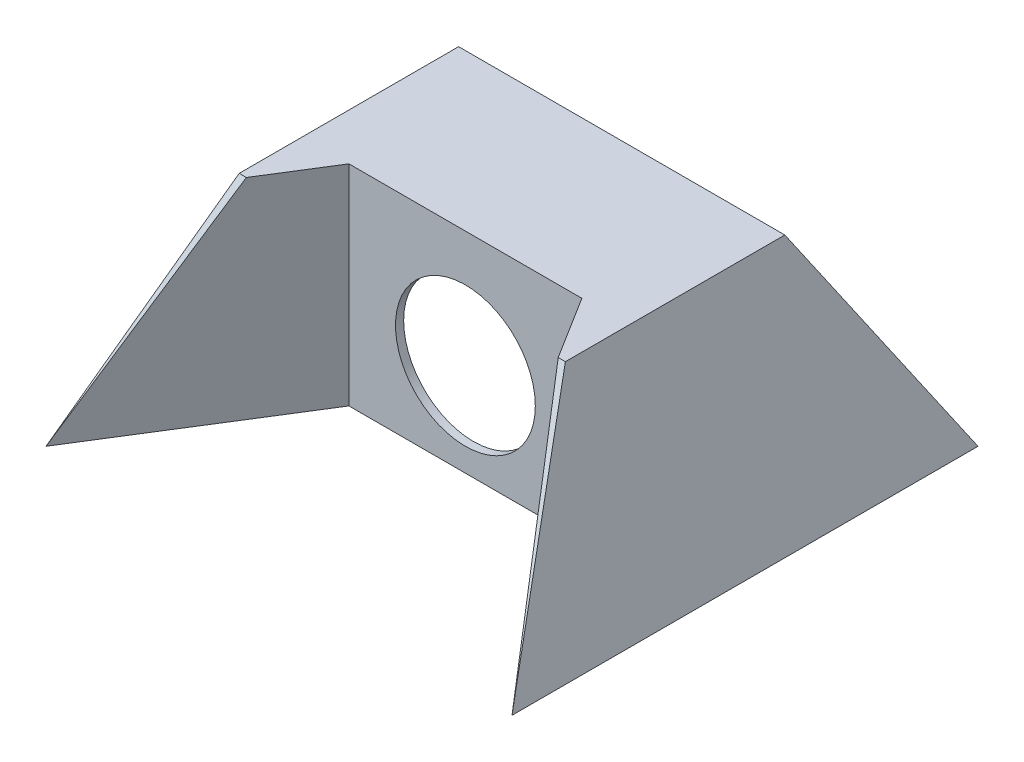
ISO-10303-21;
HEADER;
FILE_DESCRIPTION(('STEP AP214'),'2;1');
FILE_NAME('part.step','',(''),(''),'','','');
FILE_SCHEMA(('AUTOMOTIVE_DESIGN { 1 0 10303 214 1 1 1 1 }'));
ENDSEC;
DATA;
#1=APPLICATION_CONTEXT('core data for automotive mechanical design processes');
#2=APPLICATION_PROTOCOL_DEFINITION('international standard','automotive_design',2000,#1);
#3=PRODUCT_CONTEXT('',#1,'mechanical');
#4=PRODUCT('Part','Part','',(#3));
#5=PRODUCT_RELATED_PRODUCT_CATEGORY('part','',(#4));
#6=PRODUCT_DEFINITION_FORMATION('','',#4);
#7=PRODUCT_DEFINITION_CONTEXT('part definition',#1,'design');
#8=PRODUCT_DEFINITION('design','',#6,#7);
#9=PRODUCT_DEFINITION_SHAPE('','',#8);
#10=(LENGTH_UNIT() NAMED_UNIT(*) SI_UNIT(.MILLI.,.METRE.));
#11=(NAMED_UNIT(*) PLANE_ANGLE_UNIT() SI_UNIT($,.RADIAN.));
#12=(NAMED_UNIT(*) SI_UNIT($,.STERADIAN.) SOLID_ANGLE_UNIT());
#13=UNCERTAINTY_MEASURE_WITH_UNIT(LENGTH_MEASURE(1.E-05),#10,'distance_accuracy_value','');
#14=(GEOMETRIC_REPRESENTATION_CONTEXT(3) GLOBAL_UNCERTAINTY_ASSIGNED_CONTEXT((#13)) GLOBAL_UNIT_ASSIGNED_CONTEXT((#10,
#11,#12)) REPRESENTATION_CONTEXT('',''));
#15=CARTESIAN_POINT('',(0.,0.,0.));
#16=DIRECTION('',(0.,0.,1.));
#17=DIRECTION('',(1.,0.,0.));
#18=AXIS2_PLACEMENT_3D('',#15,#16,#17);
#19=CARTESIAN_POINT('',(0.,0.,-100.));
#20=DIRECTION('',(0.,-1.,0.));
#21=DIRECTION('',(0.,0.,-1.));
#22=AXIS2_PLACEMENT_3D('',#19,#20,#21);
#23=PLANE('',#22);
#24=DIRECTION('',(0.52999894000318,0.,0.847998304005088));
#25=VECTOR('',#24,1.);
#26=CARTESIAN_POINT('',(100.,0.,0.));
#27=LINE('',#26,#25);
#28=CARTESIAN_POINT('',(75.,0.,-40.));
#29=VERTEX_POINT('',#28);
#30=CARTESIAN_POINT('',(100.,0.,0.));
#31=VERTEX_POINT('',#30);
#32=EDGE_CURVE('E198',#29,#31,#27,.T.);
#33=ORIENTED_EDGE('',*,*,#32,.F.);
#34=DIRECTION('',(1.,0.,0.));
#35=VECTOR('',#34,1.);
#36=CARTESIAN_POINT('',(75.,0.,-40.));
#37=LINE('',#36,#35);
#38=CARTESIAN_POINT('',(25.,0.,-40.));
#39=VERTEX_POINT('',#38);
#40=EDGE_CURVE('E207',#39,#29,#37,.T.);
#41=ORIENTED_EDGE('',*,*,#40,.F.);
#42=DIRECTION('',(0.52999894000318,0.,-0.847998304005088));
#43=VECTOR('',#42,1.);
#44=CARTESIAN_POINT('',(25.,0.,-40.));
#45=LINE('',#44,#43);
#46=CARTESIAN_POINT('',(0.,0.,0.));
#47=VERTEX_POINT('',#46);
#48=EDGE_CURVE('E183',#47,#39,#45,.T.);
#49=ORIENTED_EDGE('',*,*,#48,.F.);
#50=DIRECTION('',(0.,0.,1.));
#51=VECTOR('',#50,1.);
#52=CARTESIAN_POINT('',(0.,0.,-100.));
#53=LINE('',#52,#51);
#54=CARTESIAN_POINT('',(0.,0.,-100.));
#55=VERTEX_POINT('',#54);
#56=EDGE_CURVE('E235',#55,#47,#53,.T.);
#57=ORIENTED_EDGE('',*,*,#56,.F.);
#58=DIRECTION('',(1.,0.,0.));
#59=VECTOR('',#58,1.);
#60=CARTESIAN_POINT('',(0.,0.,-100.));
#61=LINE('',#60,#59);
#62=CARTESIAN_POINT('',(100.,0.,-100.));
#63=VERTEX_POINT('',#62);
#64=EDGE_CURVE('E232',#55,#63,#61,.T.);
#65=ORIENTED_EDGE('',*,*,#64,.T.);
#66=DIRECTION('',(0.,0.,1.));
#67=VECTOR('',#66,1.);
#68=CARTESIAN_POINT('',(100.,0.,-100.));
#69=LINE('',#68,#67);
#70=EDGE_CURVE('E242',#63,#31,#69,.T.);
#71=ORIENTED_EDGE('',*,*,#70,.T.);
#72=EDGE_LOOP('',(#33,#41,#49,#57,#65,#71));
#73=FACE_BOUND('',#72,.T.);
#74=DIRECTION('',(1.,0.,0.));
#75=VECTOR('',#74,1.);
#76=CARTESIAN_POINT('',(0.,0.,-41.75));
#77=LINE('',#76,#75);
#78=CARTESIAN_POINT('',(24.0300666273626,0.,-41.75));
#79=VERTEX_POINT('',#78);
#80=CARTESIAN_POINT('',(75.9699333726374,0.,-41.75));
#81=VERTEX_POINT('',#80);
#82=EDGE_CURVE('E190',#79,#81,#77,.T.);
#83=ORIENTED_EDGE('',*,*,#82,.T.);
#84=DIRECTION('',(0.52999894000318,0.,0.847998304005088));
#85=VECTOR('',#84,1.);
#86=CARTESIAN_POINT('',(28.4502891668404,0.,-117.781430729275));
#87=LINE('',#86,#85);
#88=CARTESIAN_POINT('',(98.1553380315684,0.,-6.25335254571031));
#89=VERTEX_POINT('',#88);
#90=EDGE_CURVE('E175',#81,#89,#87,.T.);
#91=ORIENTED_EDGE('',*,*,#90,.T.);
#92=DIRECTION('',(0.,0.,1.));
#93=VECTOR('',#92,1.);
#94=CARTESIAN_POINT('',(98.1553380315685,0.,-100.));
#95=LINE('',#94,#93);
#96=CARTESIAN_POINT('',(98.1553380315684,0.,-97.9699744092984));
#97=VERTEX_POINT('',#96);
#98=EDGE_CURVE('E149',#97,#89,#95,.T.);
#99=ORIENTED_EDGE('',*,*,#98,.F.);
#100=DIRECTION('',(1.,0.,0.));
#101=VECTOR('',#100,1.);
#102=CARTESIAN_POINT('',(0.,0.,-97.9699744092984));
#103=LINE('',#102,#101);
#104=CARTESIAN_POINT('',(1.84466196843156,0.,-97.9699744092984));
#105=VERTEX_POINT('',#104);
#106=EDGE_CURVE('E56',#105,#97,#103,.T.);
#107=ORIENTED_EDGE('',*,*,#106,.F.);
#108=DIRECTION('',(0.,0.,1.));
#109=VECTOR('',#108,1.);
#110=CARTESIAN_POINT('',(1.84466196843156,0.,-100.));
#111=LINE('',#110,#109);
#112=CARTESIAN_POINT('',(1.84466196843156,0.,-6.2533525457103));
#113=VERTEX_POINT('',#112);
#114=EDGE_CURVE('E184',#105,#113,#111,.T.);
#115=ORIENTED_EDGE('',*,*,#114,.T.);
#116=DIRECTION('',(0.52999894000318,0.,-0.847998304005088));
#117=VECTOR('',#116,1.);
#118=CARTESIAN_POINT('',(43.4598231927102,0.,-72.8376105045561));
#119=LINE('',#118,#117);
#120=EDGE_CURVE('E193',#113,#79,#119,.T.);
#121=ORIENTED_EDGE('',*,*,#120,.T.);
#122=EDGE_LOOP('',(#83,#91,#99,#107,#115,#121));
#123=FACE_BOUND('',#122,.T.);
#124=ADVANCED_FACE('F40',(#73,#123),#23,.T.);
#125=CARTESIAN_POINT('',(100.,0.,0.));
#126=DIRECTION('',(0.,-0.50680946650861,-0.862058098191333));
#127=DIRECTION('',(0.,0.862058098191333,-0.50680946650861));
#128=AXIS2_PLACEMENT_3D('',#125,#126,#127);
#129=PLANE('',#128);
#130=DIRECTION('',(-1.,0.,0.));
#131=VECTOR('',#130,1.);
#132=CARTESIAN_POINT('',(100.,45.,-26.4557876560027));
#133=LINE('',#132,#131);
#134=CARTESIAN_POINT('',(85.,45.,-26.4557876560027));
#135=VERTEX_POINT('',#134);
#136=CARTESIAN_POINT('',(83.4651327149983,45.,-26.4557876560027));
#137=VERTEX_POINT('',#136);
#138=EDGE_CURVE('E215',#135,#137,#133,.T.);
#139=ORIENTED_EDGE('',*,*,#138,.T.);
#140=DIRECTION('',(0.301969032822476,-0.82181527331261,0.483150452515961));
#141=VECTOR('',#140,1.);
#142=CARTESIAN_POINT('',(100.,0.,0.));
#143=LINE('',#142,#141);
#144=EDGE_CURVE('E11',#137,#31,#143,.T.);
#145=ORIENTED_EDGE('',*,*,#144,.T.);
#146=DIRECTION('',(-0.276176659095958,0.828529977287874,-0.487098069905794));
#147=VECTOR('',#146,1.);
#148=CARTESIAN_POINT('',(86.5474882401328,40.3575352796015,-23.726452970595));
#149=LINE('',#148,#147);
#150=EDGE_CURVE('E218',#31,#135,#149,.T.);
#151=ORIENTED_EDGE('',*,*,#150,.T.);
#152=EDGE_LOOP('',(#139,#145,#151));
#153=FACE_BOUND('',#152,.T.);
#154=ADVANCED_FACE('F270',(#153),#129,.F.);
#155=CARTESIAN_POINT('',(15.,45.,-100.));
#156=DIRECTION('',(-0.948683298050514,0.316227766016838,0.));
#157=DIRECTION('',(-0.316227766016838,-0.948683298050514,0.));
#158=AXIS2_PLACEMENT_3D('',#155,#156,#157);
#159=PLANE('',#158);
#160=DIRECTION('',(-0.276176659095958,-0.828529977287874,0.487098069905794));
#161=VECTOR('',#160,1.);
#162=CARTESIAN_POINT('',(24.8935438142779,74.6806314428337,-43.9052206103958));
#163=LINE('',#162,#161);
#164=CARTESIAN_POINT('',(15.,45.,-26.4557876560027));
#165=VERTEX_POINT('',#164);
#166=EDGE_CURVE('E220',#165,#47,#163,.T.);
#167=ORIENTED_EDGE('',*,*,#166,.F.);
#168=DIRECTION('',(0.,0.,1.));
#169=VECTOR('',#168,1.);
#170=CARTESIAN_POINT('',(15.,45.,-100.));
#171=LINE('',#170,#169);
#172=CARTESIAN_POINT('',(15.,45.,-73.5442123439973));
#173=VERTEX_POINT('',#172);
#174=EDGE_CURVE('E236',#173,#165,#171,.T.);
#175=ORIENTED_EDGE('',*,*,#174,.F.);
#176=DIRECTION('',(-0.276176659095958,-0.828529977287874,-0.487098069905794));
#177=VECTOR('',#176,1.);
#178=CARTESIAN_POINT('',(11.4410320544107,34.3230961632322,-79.8212323601993));
#179=LINE('',#178,#177);
#180=EDGE_CURVE('E229',#173,#55,#179,.T.);
#181=ORIENTED_EDGE('',*,*,#180,.T.);
#182=ORIENTED_EDGE('',*,*,#56,.T.);
#183=EDGE_LOOP('',(#167,#175,#181,#182));
#184=FACE_BOUND('',#183,.T.);
#185=ADVANCED_FACE('F42',(#184),#159,.T.);
#186=CARTESIAN_POINT('',(85.,45.,-100.));
#187=DIRECTION('',(0.,1.,0.));
#188=DIRECTION('',(-1.,0.,0.));
#189=AXIS2_PLACEMENT_3D('',#186,#187,#188);
#190=PLANE('',#189);
#191=DIRECTION('',(0.52999894000318,0.,0.847998304005088));
#192=VECTOR('',#191,1.);
#193=CARTESIAN_POINT('',(100.,45.,0.));
#194=LINE('',#193,#192);
#195=CARTESIAN_POINT('',(75.,45.,-40.));
#196=VERTEX_POINT('',#195);
#197=EDGE_CURVE('E201',#196,#137,#194,.T.);
#198=ORIENTED_EDGE('',*,*,#197,.T.);
#199=ORIENTED_EDGE('',*,*,#138,.F.);
#200=DIRECTION('',(0.,0.,1.));
#201=VECTOR('',#200,1.);
#202=CARTESIAN_POINT('',(85.,45.,-100.));
#203=LINE('',#202,#201);
#204=CARTESIAN_POINT('',(85.,45.,-73.5442123439973));
#205=VERTEX_POINT('',#204);
#206=EDGE_CURVE('E239',#205,#135,#203,.T.);
#207=ORIENTED_EDGE('',*,*,#206,.F.);
#208=DIRECTION('',(-1.,0.,0.));
#209=VECTOR('',#208,1.);
#210=CARTESIAN_POINT('',(100.,45.,-73.5442123439973));
#211=LINE('',#210,#209);
#212=EDGE_CURVE('E223',#205,#173,#211,.T.);
#213=ORIENTED_EDGE('',*,*,#212,.T.);
#214=ORIENTED_EDGE('',*,*,#174,.T.);
#215=CARTESIAN_POINT('',(16.5348672850017,45.,-26.4557876560027));
#216=VERTEX_POINT('',#215);
#217=EDGE_CURVE('E213',#216,#165,#133,.T.);
#218=ORIENTED_EDGE('',*,*,#217,.F.);
#219=DIRECTION('',(0.52999894000318,0.,-0.847998304005088));
#220=VECTOR('',#219,1.);
#221=CARTESIAN_POINT('',(25.,45.,-40.));
#222=LINE('',#221,#220);
#223=CARTESIAN_POINT('',(25.,45.,-40.));
#224=VERTEX_POINT('',#223);
#225=EDGE_CURVE('E64',#216,#224,#222,.T.);
#226=ORIENTED_EDGE('',*,*,#225,.T.);
#227=DIRECTION('',(1.,0.,0.));
#228=VECTOR('',#227,1.);
#229=CARTESIAN_POINT('',(75.,45.,-40.));
#230=LINE('',#229,#228);
#231=EDGE_CURVE('E197',#224,#196,#230,.T.);
#232=ORIENTED_EDGE('',*,*,#231,.T.);
#233=EDGE_LOOP('',(#198,#199,#207,#213,#214,#218,#226,#232));
#234=FACE_BOUND('',#233,.T.);
#235=ADVANCED_FACE('F253',(#234),#190,.T.);
#236=CARTESIAN_POINT('',(100.,0.,-100.));
#237=DIRECTION('',(0.948683298050514,0.316227766016838,0.));
#238=DIRECTION('',(-0.316227766016838,0.948683298050514,0.));
#239=AXIS2_PLACEMENT_3D('',#236,#237,#238);
#240=PLANE('',#239);
#241=ORIENTED_EDGE('',*,*,#150,.F.);
#242=ORIENTED_EDGE('',*,*,#70,.F.);
#243=DIRECTION('',(-0.276176659095958,0.828529977287874,0.487098069905794));
#244=VECTOR('',#243,1.);
#245=CARTESIAN_POINT('',(100.,0.,-100.));
#246=LINE('',#245,#244);
#247=EDGE_CURVE('E226',#63,#205,#246,.T.);
#248=ORIENTED_EDGE('',*,*,#247,.T.);
#249=ORIENTED_EDGE('',*,*,#206,.T.);
#250=EDGE_LOOP('',(#241,#242,#248,#249));
#251=FACE_BOUND('',#250,.T.);
#252=ADVANCED_FACE('F274',(#251),#240,.T.);
#253=CARTESIAN_POINT('',(100.,0.,-100.));
#254=DIRECTION('',(0.,0.50680946650861,-0.862058098191333));
#255=DIRECTION('',(0.,0.862058098191333,0.50680946650861));
#256=AXIS2_PLACEMENT_3D('',#253,#254,#255);
#257=PLANE('',#256);
#258=ORIENTED_EDGE('',*,*,#212,.F.);
#259=ORIENTED_EDGE('',*,*,#247,.F.);
#260=ORIENTED_EDGE('',*,*,#64,.F.);
#261=ORIENTED_EDGE('',*,*,#180,.F.);
#262=EDGE_LOOP('',(#258,#259,#260,#261));
#263=FACE_BOUND('',#262,.T.);
#264=ADVANCED_FACE('F283',(#263),#257,.T.);
#265=ORIENTED_EDGE('',*,*,#166,.T.);
#266=DIRECTION('',(0.301969032822476,0.82181527331261,-0.483150452515961));
#267=VECTOR('',#266,1.);
#268=CARTESIAN_POINT('',(9.11852967837415,24.8162763240948,-14.5896474853986));
#269=LINE('',#268,#267);
#270=EDGE_CURVE('E49',#47,#216,#269,.T.);
#271=ORIENTED_EDGE('',*,*,#270,.T.);
#272=ORIENTED_EDGE('',*,*,#217,.T.);
#273=EDGE_LOOP('',(#265,#271,#272));
#274=FACE_BOUND('',#273,.T.);
#275=ADVANCED_FACE('F249',(#274),#129,.F.);
#276=CARTESIAN_POINT('',(100.,45.,0.));
#277=DIRECTION('',(0.847998304005088,0.,-0.52999894000318));
#278=DIRECTION('',(-0.52999894000318,0.,-0.847998304005088));
#279=AXIS2_PLACEMENT_3D('',#276,#277,#278);
#280=PLANE('',#279);
#281=ORIENTED_EDGE('',*,*,#197,.F.);
#282=DIRECTION('',(0.,-1.,0.));
#283=VECTOR('',#282,1.);
#284=CARTESIAN_POINT('',(75.,45.,-40.));
#285=LINE('',#284,#283);
#286=EDGE_CURVE('E211',#196,#29,#285,.T.);
#287=ORIENTED_EDGE('',*,*,#286,.T.);
#288=ORIENTED_EDGE('',*,*,#32,.T.);
#289=ORIENTED_EDGE('',*,*,#144,.F.);
#290=EDGE_LOOP('',(#281,#287,#288,#289));
#291=FACE_BOUND('',#290,.T.);
#292=ADVANCED_FACE('F275',(#291),#280,.F.);
#293=CARTESIAN_POINT('',(25.,45.,-40.));
#294=DIRECTION('',(-0.847998304005088,0.,-0.52999894000318));
#295=DIRECTION('',(-0.52999894000318,0.,0.847998304005088));
#296=AXIS2_PLACEMENT_3D('',#293,#294,#295);
#297=PLANE('',#296);
#298=ORIENTED_EDGE('',*,*,#48,.T.);
#299=DIRECTION('',(0.,-1.,0.));
#300=VECTOR('',#299,1.);
#301=CARTESIAN_POINT('',(25.,45.,-40.));
#302=LINE('',#301,#300);
#303=EDGE_CURVE('E204',#224,#39,#302,.T.);
#304=ORIENTED_EDGE('',*,*,#303,.F.);
#305=ORIENTED_EDGE('',*,*,#225,.F.);
#306=ORIENTED_EDGE('',*,*,#270,.F.);
#307=EDGE_LOOP('',(#298,#304,#305,#306));
#308=FACE_BOUND('',#307,.T.);
#309=ADVANCED_FACE('F262',(#308),#297,.F.);
#310=CARTESIAN_POINT('',(75.,45.,-40.));
#311=DIRECTION('',(0.,0.,-1.));
#312=DIRECTION('',(-1.,0.,0.));
#313=AXIS2_PLACEMENT_3D('',#310,#311,#312);
#314=PLANE('',#313);
#315=CARTESIAN_POINT('',(50.,20.,-40.));
#316=DIRECTION('',(0.,0.,1.));
#317=DIRECTION('',(1.,0.,0.));
#318=AXIS2_PLACEMENT_3D('',#315,#316,#317);
#319=CIRCLE('',#318,15.);
#320=CARTESIAN_POINT('',(65.,20.,-40.));
#321=VERTEX_POINT('',#320);
#322=EDGE_CURVE('E169',#321,#321,#319,.T.);
#323=ORIENTED_EDGE('',*,*,#322,.F.);
#324=EDGE_LOOP('',(#323));
#325=FACE_BOUND('',#324,.T.);
#326=ORIENTED_EDGE('',*,*,#40,.T.);
#327=ORIENTED_EDGE('',*,*,#286,.F.);
#328=ORIENTED_EDGE('',*,*,#231,.F.);
#329=ORIENTED_EDGE('',*,*,#303,.T.);
#330=EDGE_LOOP('',(#326,#327,#328,#329));
#331=FACE_BOUND('',#330,.T.);
#332=ADVANCED_FACE('F265',(#325,#331),#314,.F.);
#333=CARTESIAN_POINT('',(16.6601957715884,44.4466014094705,-100.));
#334=DIRECTION('',(-0.948683298050514,0.316227766016838,0.));
#335=DIRECTION('',(-0.316227766016838,-0.948683298050514,0.));
#336=AXIS2_PLACEMENT_3D('',#333,#334,#335);
#337=PLANE('',#336);
#338=DIRECTION('',(0.28216632399155,0.846498971974651,-0.45146611838648));
#339=VECTOR('',#338,1.);
#340=CARTESIAN_POINT('',(18.7355834619373,50.6727644805172,-33.2788269353195));
#341=LINE('',#340,#339);
#342=CARTESIAN_POINT('',(16.2613286350982,43.25,-29.320019212377));
#343=VERTEX_POINT('',#342);
#344=EDGE_CURVE('E158',#113,#343,#341,.T.);
#345=ORIENTED_EDGE('',*,*,#344,.F.);
#346=ORIENTED_EDGE('',*,*,#114,.F.);
#347=DIRECTION('',(-0.276176659095958,-0.828529977287874,-0.487098069905794));
#348=VECTOR('',#347,1.);
#349=CARTESIAN_POINT('',(12.8719056801223,33.0817311350723,-78.5210132047995));
#350=LINE('',#349,#348);
#351=CARTESIAN_POINT('',(16.2613286350982,43.25,-72.543022939918));
#352=VERTEX_POINT('',#351);
#353=EDGE_CURVE('E177',#352,#105,#350,.T.);
#354=ORIENTED_EDGE('',*,*,#353,.F.);
#355=DIRECTION('',(0.,0.,1.));
#356=VECTOR('',#355,1.);
#357=CARTESIAN_POINT('',(16.2613286350982,43.25,-100.));
#358=LINE('',#357,#356);
#359=EDGE_CURVE('E148',#352,#343,#358,.T.);
#360=ORIENTED_EDGE('',*,*,#359,.T.);
#361=EDGE_LOOP('',(#345,#346,#354,#360));
#362=FACE_BOUND('',#361,.T.);
#363=ADVANCED_FACE('F301',(#362),#337,.F.);
#364=CARTESIAN_POINT('',(85.,43.25,-100.));
#365=DIRECTION('',(0.,1.,0.));
#366=DIRECTION('',(-1.,0.,0.));
#367=AXIS2_PLACEMENT_3D('',#364,#365,#366);
#368=PLANE('',#367);
#369=DIRECTION('',(0.52999894000318,0.,0.847998304005088));
#370=VECTOR('',#369,1.);
#371=CARTESIAN_POINT('',(101.483997032009,43.25,-0.927498145005564));
#372=LINE('',#371,#370);
#373=CARTESIAN_POINT('',(75.9699333726374,43.25,-41.75));
#374=VERTEX_POINT('',#373);
#375=CARTESIAN_POINT('',(83.7386713649018,43.25,-29.320019212377));
#376=VERTEX_POINT('',#375);
#377=EDGE_CURVE('E142',#374,#376,#372,.T.);
#378=ORIENTED_EDGE('',*,*,#377,.F.);
#379=DIRECTION('',(1.,0.,0.));
#380=VECTOR('',#379,1.);
#381=CARTESIAN_POINT('',(75.,43.25,-41.75));
#382=LINE('',#381,#380);
#383=CARTESIAN_POINT('',(24.0300666273626,43.25,-41.75));
#384=VERTEX_POINT('',#383);
#385=EDGE_CURVE('E163',#384,#374,#382,.T.);
#386=ORIENTED_EDGE('',*,*,#385,.F.);
#387=DIRECTION('',(0.52999894000318,0.,-0.847998304005088));
#388=VECTOR('',#387,1.);
#389=CARTESIAN_POINT('',(23.5160029679911,43.25,-40.9274981450056));
#390=LINE('',#389,#388);
#391=EDGE_CURVE('E166',#343,#384,#390,.T.);
#392=ORIENTED_EDGE('',*,*,#391,.F.);
#393=ORIENTED_EDGE('',*,*,#359,.F.);
#394=DIRECTION('',(-1.,0.,0.));
#395=VECTOR('',#394,1.);
#396=CARTESIAN_POINT('',(85.,43.25,-72.543022939918));
#397=LINE('',#396,#395);
#398=CARTESIAN_POINT('',(83.7386713649018,43.25,-72.543022939918));
#399=VERTEX_POINT('',#398);
#400=EDGE_CURVE('E146',#399,#352,#397,.T.);
#401=ORIENTED_EDGE('',*,*,#400,.F.);
#402=DIRECTION('',(0.,0.,1.));
#403=VECTOR('',#402,1.);
#404=CARTESIAN_POINT('',(83.7386713649018,43.25,-100.));
#405=LINE('',#404,#403);
#406=EDGE_CURVE('E137',#399,#376,#405,.T.);
#407=ORIENTED_EDGE('',*,*,#406,.T.);
#408=EDGE_LOOP('',(#378,#386,#392,#393,#401,#407));
#409=FACE_BOUND('',#408,.T.);
#410=ADVANCED_FACE('F139',(#409),#368,.F.);
#411=CARTESIAN_POINT('',(98.3398042284116,-0.553398590529467,-100.));
#412=DIRECTION('',(0.948683298050514,0.316227766016838,0.));
#413=DIRECTION('',(-0.316227766016838,0.948683298050514,0.));
#414=AXIS2_PLACEMENT_3D('',#411,#412,#413);
#415=PLANE('',#414);
#416=ORIENTED_EDGE('',*,*,#406,.F.);
#417=DIRECTION('',(-0.276176659095958,0.828529977287874,0.487098069905794));
#418=VECTOR('',#417,1.);
#419=CARTESIAN_POINT('',(98.5691263742884,-1.24136502815991,-98.6997808446003));
#420=LINE('',#419,#418);
#421=EDGE_CURVE('E172',#97,#399,#420,.T.);
#422=ORIENTED_EDGE('',*,*,#421,.F.);
#423=ORIENTED_EDGE('',*,*,#98,.T.);
#424=DIRECTION('',(-0.28216632399155,0.84649897197465,-0.451466118386481));
#425=VECTOR('',#424,1.);
#426=CARTESIAN_POINT('',(86.3599579393366,35.3861402766956,-25.1259606932813));
#427=LINE('',#426,#425);
#428=EDGE_CURVE('E152',#89,#376,#427,.T.);
#429=ORIENTED_EDGE('',*,*,#428,.T.);
#430=EDGE_LOOP('',(#416,#422,#423,#429));
#431=FACE_BOUND('',#430,.T.);
#432=ADVANCED_FACE('F153',(#431),#415,.F.);
#433=CARTESIAN_POINT('',(100.,-0.886916566390067,-98.4913983281652));
#434=DIRECTION('',(0.,0.50680946650861,-0.862058098191333));
#435=DIRECTION('',(0.,0.862058098191333,0.50680946650861));
#436=AXIS2_PLACEMENT_3D('',#433,#434,#435);
#437=PLANE('',#436);
#438=ORIENTED_EDGE('',*,*,#400,.T.);
#439=ORIENTED_EDGE('',*,*,#353,.T.);
#440=ORIENTED_EDGE('',*,*,#106,.T.);
#441=ORIENTED_EDGE('',*,*,#421,.T.);
#442=EDGE_LOOP('',(#438,#439,#440,#441));
#443=FACE_BOUND('',#442,.T.);
#444=ADVANCED_FACE('F325',(#443),#437,.F.);
#445=CARTESIAN_POINT('',(101.483997032009,45.,-0.927498145005564));
#446=DIRECTION('',(0.847998304005088,0.,-0.52999894000318));
#447=DIRECTION('',(-0.52999894000318,0.,-0.847998304005088));
#448=AXIS2_PLACEMENT_3D('',#445,#446,#447);
#449=PLANE('',#448);
#450=ORIENTED_EDGE('',*,*,#377,.T.);
#451=ORIENTED_EDGE('',*,*,#428,.F.);
#452=ORIENTED_EDGE('',*,*,#90,.F.);
#453=DIRECTION('',(0.,-1.,0.));
#454=VECTOR('',#453,1.);
#455=CARTESIAN_POINT('',(75.9699333726374,45.,-41.75));
#456=LINE('',#455,#454);
#457=EDGE_CURVE('E161',#374,#81,#456,.T.);
#458=ORIENTED_EDGE('',*,*,#457,.F.);
#459=EDGE_LOOP('',(#450,#451,#452,#458));
#460=FACE_BOUND('',#459,.T.);
#461=ADVANCED_FACE('F160',(#460),#449,.T.);
#462=CARTESIAN_POINT('',(23.5160029679911,45.,-40.9274981450056));
#463=DIRECTION('',(-0.847998304005088,0.,-0.52999894000318));
#464=DIRECTION('',(-0.52999894000318,0.,0.847998304005088));
#465=AXIS2_PLACEMENT_3D('',#462,#463,#464);
#466=PLANE('',#465);
#467=ORIENTED_EDGE('',*,*,#120,.F.);
#468=ORIENTED_EDGE('',*,*,#344,.T.);
#469=ORIENTED_EDGE('',*,*,#391,.T.);
#470=DIRECTION('',(0.,-1.,0.));
#471=VECTOR('',#470,1.);
#472=CARTESIAN_POINT('',(24.0300666273626,45.,-41.75));
#473=LINE('',#472,#471);
#474=EDGE_CURVE('E162',#384,#79,#473,.T.);
#475=ORIENTED_EDGE('',*,*,#474,.T.);
#476=EDGE_LOOP('',(#467,#468,#469,#475));
#477=FACE_BOUND('',#476,.T.);
#478=ADVANCED_FACE('F319',(#477),#466,.T.);
#479=CARTESIAN_POINT('',(75.,45.,-41.75));
#480=DIRECTION('',(0.,0.,-1.));
#481=DIRECTION('',(-1.,0.,0.));
#482=AXIS2_PLACEMENT_3D('',#479,#480,#481);
#483=PLANE('',#482);
#484=CARTESIAN_POINT('',(50.,20.,-41.75));
#485=DIRECTION('',(0.,0.,-1.));
#486=DIRECTION('',(-1.,0.,0.));
#487=AXIS2_PLACEMENT_3D('',#484,#485,#486);
#488=CIRCLE('',#487,15.);
#489=CARTESIAN_POINT('',(35.,20.,-41.75));
#490=VERTEX_POINT('',#489);
#491=EDGE_CURVE('E44',#490,#490,#488,.T.);
#492=ORIENTED_EDGE('',*,*,#491,.F.);
#493=EDGE_LOOP('',(#492));
#494=FACE_BOUND('',#493,.T.);
#495=ORIENTED_EDGE('',*,*,#82,.F.);
#496=ORIENTED_EDGE('',*,*,#474,.F.);
#497=ORIENTED_EDGE('',*,*,#385,.T.);
#498=ORIENTED_EDGE('',*,*,#457,.T.);
#499=EDGE_LOOP('',(#495,#496,#497,#498));
#500=FACE_BOUND('',#499,.T.);
#501=ADVANCED_FACE('F317',(#494,#500),#483,.T.);
#502=CARTESIAN_POINT('',(50.,20.,-42.));
#503=DIRECTION('',(0.,0.,1.));
#504=DIRECTION('',(1.,0.,0.));
#505=AXIS2_PLACEMENT_3D('',#502,#503,#504);
#506=CYLINDRICAL_SURFACE('',#505,15.);
#507=ORIENTED_EDGE('',*,*,#491,.T.);
#508=EDGE_LOOP('',(#507));
#509=FACE_BOUND('',#508,.T.);
#510=ORIENTED_EDGE('',*,*,#322,.T.);
#511=EDGE_LOOP('',(#510));
#512=FACE_BOUND('',#511,.T.);
#513=ADVANCED_FACE('F315',(#509,#512),#506,.F.);
#514=CLOSED_SHELL('',(#124,#154,#185,#235,#252,#264,#275,#292,#309,#332,#363,#410,#432,#444,
#461,#478,#501,#513));
#515=MANIFOLD_SOLID_BREP('B2',#514);
#516=ADVANCED_BREP_SHAPE_REPRESENTATION('',(#18,#515),#14);
#517=SHAPE_DEFINITION_REPRESENTATION(#9,#516);
ENDSEC;
END-ISO-10303-21;
